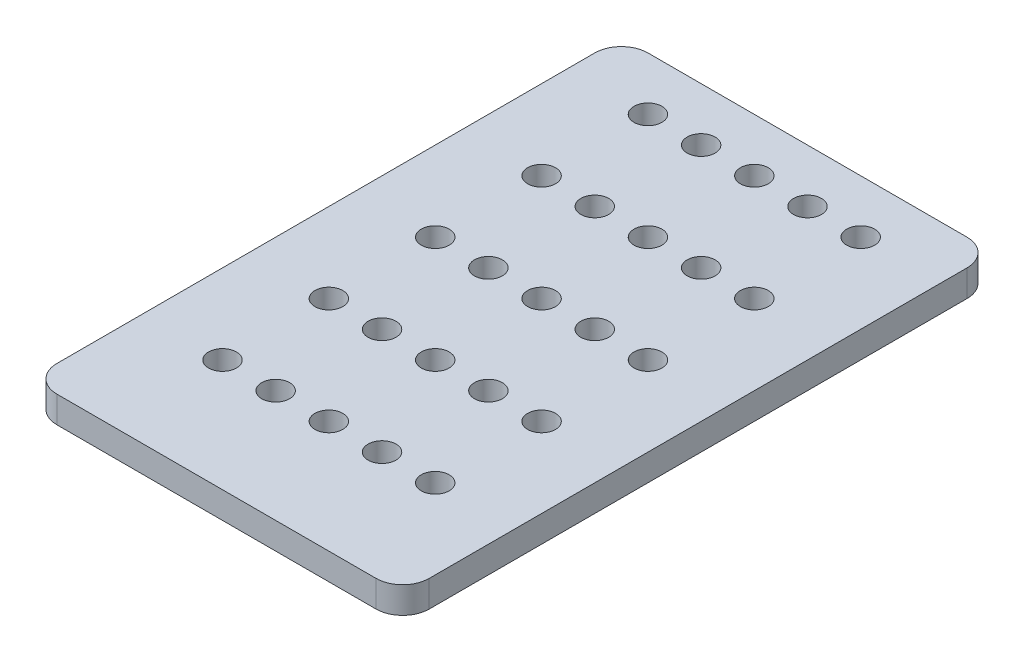
ISO-10303-21;
HEADER;
FILE_DESCRIPTION(('STEP AP214'),'2;1');
FILE_NAME('part.step','',(''),(''),'','','');
FILE_SCHEMA(('AUTOMOTIVE_DESIGN { 1 0 10303 214 1 1 1 1 }'));
ENDSEC;
DATA;
#1=APPLICATION_CONTEXT('core data for automotive mechanical design processes');
#2=APPLICATION_PROTOCOL_DEFINITION('international standard','automotive_design',2000,#1);
#3=PRODUCT_CONTEXT('',#1,'mechanical');
#4=PRODUCT('Part','Part','',(#3));
#5=PRODUCT_RELATED_PRODUCT_CATEGORY('part','',(#4));
#6=PRODUCT_DEFINITION_FORMATION('','',#4);
#7=PRODUCT_DEFINITION_CONTEXT('part definition',#1,'design');
#8=PRODUCT_DEFINITION('design','',#6,#7);
#9=PRODUCT_DEFINITION_SHAPE('','',#8);
#10=(LENGTH_UNIT() NAMED_UNIT(*) SI_UNIT(.MILLI.,.METRE.));
#11=(NAMED_UNIT(*) PLANE_ANGLE_UNIT() SI_UNIT($,.RADIAN.));
#12=(NAMED_UNIT(*) SI_UNIT($,.STERADIAN.) SOLID_ANGLE_UNIT());
#13=UNCERTAINTY_MEASURE_WITH_UNIT(LENGTH_MEASURE(1.E-05),#10,'distance_accuracy_value','');
#14=(GEOMETRIC_REPRESENTATION_CONTEXT(3) GLOBAL_UNCERTAINTY_ASSIGNED_CONTEXT((#13)) GLOBAL_UNIT_ASSIGNED_CONTEXT((#10,
#11,#12)) REPRESENTATION_CONTEXT('',''));
#15=CARTESIAN_POINT('',(0.,0.,0.));
#16=DIRECTION('',(0.,0.,1.));
#17=DIRECTION('',(1.,0.,0.));
#18=AXIS2_PLACEMENT_3D('',#15,#16,#17);
#19=CARTESIAN_POINT('',(0.,4.,0.));
#20=DIRECTION('',(0.,1.,0.));
#21=DIRECTION('',(0.,0.,1.));
#22=AXIS2_PLACEMENT_3D('',#19,#20,#21);
#23=PLANE('',#22);
#24=CARTESIAN_POINT('',(6.6644554730061E-13,4.,64.));
#25=DIRECTION('',(0.,1.,0.));
#26=DIRECTION('',(0.,0.,1.));
#27=AXIS2_PLACEMENT_3D('',#24,#25,#26);
#28=CIRCLE('',#27,2.1);
#29=CARTESIAN_POINT('',(6.6644554730061E-13,4.,66.1));
#30=VERTEX_POINT('',#29);
#31=EDGE_CURVE('E377',#30,#30,#28,.T.);
#32=ORIENTED_EDGE('',*,*,#31,.F.);
#33=EDGE_LOOP('',(#32));
#34=FACE_BOUND('',#33,.T.);
#35=CARTESIAN_POINT('',(16.0000000000007,4.,64.));
#36=DIRECTION('',(0.,1.,0.));
#37=DIRECTION('',(0.,0.,1.));
#38=AXIS2_PLACEMENT_3D('',#35,#36,#37);
#39=CIRCLE('',#38,2.1);
#40=CARTESIAN_POINT('',(16.0000000000007,4.,66.1));
#41=VERTEX_POINT('',#40);
#42=EDGE_CURVE('E361',#41,#41,#39,.T.);
#43=ORIENTED_EDGE('',*,*,#42,.F.);
#44=EDGE_LOOP('',(#43));
#45=FACE_BOUND('',#44,.T.);
#46=CARTESIAN_POINT('',(8.0000000000005,4.,48.));
#47=DIRECTION('',(0.,1.,0.));
#48=DIRECTION('',(0.,0.,1.));
#49=AXIS2_PLACEMENT_3D('',#46,#47,#48);
#50=CIRCLE('',#49,2.1);
#51=CARTESIAN_POINT('',(8.0000000000005,4.,50.1));
#52=VERTEX_POINT('',#51);
#53=EDGE_CURVE('E345',#52,#52,#50,.T.);
#54=ORIENTED_EDGE('',*,*,#53,.F.);
#55=EDGE_LOOP('',(#54));
#56=FACE_BOUND('',#55,.T.);
#57=CARTESIAN_POINT('',(-7.9999999999995,4.,48.));
#58=DIRECTION('',(0.,1.,0.));
#59=DIRECTION('',(0.,0.,1.));
#60=AXIS2_PLACEMENT_3D('',#57,#58,#59);
#61=CIRCLE('',#60,2.1);
#62=CARTESIAN_POINT('',(-7.9999999999995,4.,50.1));
#63=VERTEX_POINT('',#62);
#64=EDGE_CURVE('E329',#63,#63,#61,.T.);
#65=ORIENTED_EDGE('',*,*,#64,.F.);
#66=EDGE_LOOP('',(#65));
#67=FACE_BOUND('',#66,.T.);
#68=CARTESIAN_POINT('',(-15.9999999999995,4.,48.));
#69=DIRECTION('',(0.,1.,0.));
#70=DIRECTION('',(0.,0.,1.));
#71=AXIS2_PLACEMENT_3D('',#68,#69,#70);
#72=CIRCLE('',#71,2.1);
#73=CARTESIAN_POINT('',(-15.9999999999995,4.,50.1));
#74=VERTEX_POINT('',#73);
#75=EDGE_CURVE('E313',#74,#74,#72,.T.);
#76=ORIENTED_EDGE('',*,*,#75,.F.);
#77=EDGE_LOOP('',(#76));
#78=FACE_BOUND('',#77,.T.);
#79=CARTESIAN_POINT('',(3.33222773650305E-13,4.,32.));
#80=DIRECTION('',(0.,1.,0.));
#81=DIRECTION('',(0.,0.,1.));
#82=AXIS2_PLACEMENT_3D('',#79,#80,#81);
#83=CIRCLE('',#82,2.1);
#84=CARTESIAN_POINT('',(3.33222773650305E-13,4.,34.1));
#85=VERTEX_POINT('',#84);
#86=EDGE_CURVE('E297',#85,#85,#83,.T.);
#87=ORIENTED_EDGE('',*,*,#86,.F.);
#88=EDGE_LOOP('',(#87));
#89=FACE_BOUND('',#88,.T.);
#90=CARTESIAN_POINT('',(16.0000000000003,4.,32.));
#91=DIRECTION('',(0.,1.,0.));
#92=DIRECTION('',(0.,0.,1.));
#93=AXIS2_PLACEMENT_3D('',#90,#91,#92);
#94=CIRCLE('',#93,2.1);
#95=CARTESIAN_POINT('',(16.0000000000003,4.,34.1));
#96=VERTEX_POINT('',#95);
#97=EDGE_CURVE('E281',#96,#96,#94,.T.);
#98=ORIENTED_EDGE('',*,*,#97,.F.);
#99=EDGE_LOOP('',(#98));
#100=FACE_BOUND('',#99,.T.);
#101=CARTESIAN_POINT('',(8.00000000000017,4.,16.));
#102=DIRECTION('',(0.,1.,0.));
#103=DIRECTION('',(0.,0.,1.));
#104=AXIS2_PLACEMENT_3D('',#101,#102,#103);
#105=CIRCLE('',#104,2.1);
#106=CARTESIAN_POINT('',(8.00000000000017,4.,18.1));
#107=VERTEX_POINT('',#106);
#108=EDGE_CURVE('E265',#107,#107,#105,.T.);
#109=ORIENTED_EDGE('',*,*,#108,.F.);
#110=EDGE_LOOP('',(#109));
#111=FACE_BOUND('',#110,.T.);
#112=CARTESIAN_POINT('',(-7.99999999999983,4.,16.));
#113=DIRECTION('',(0.,1.,0.));
#114=DIRECTION('',(0.,0.,1.));
#115=AXIS2_PLACEMENT_3D('',#112,#113,#114);
#116=CIRCLE('',#115,2.1);
#117=CARTESIAN_POINT('',(-7.99999999999983,4.,18.1));
#118=VERTEX_POINT('',#117);
#119=EDGE_CURVE('E249',#118,#118,#116,.T.);
#120=ORIENTED_EDGE('',*,*,#119,.F.);
#121=EDGE_LOOP('',(#120));
#122=FACE_BOUND('',#121,.T.);
#123=CARTESIAN_POINT('',(-15.9999999999998,4.,16.));
#124=DIRECTION('',(0.,1.,0.));
#125=DIRECTION('',(0.,0.,1.));
#126=AXIS2_PLACEMENT_3D('',#123,#124,#125);
#127=CIRCLE('',#126,2.1);
#128=CARTESIAN_POINT('',(-15.9999999999998,4.,18.1));
#129=VERTEX_POINT('',#128);
#130=EDGE_CURVE('E233',#129,#129,#127,.T.);
#131=ORIENTED_EDGE('',*,*,#130,.F.);
#132=EDGE_LOOP('',(#131));
#133=FACE_BOUND('',#132,.T.);
#134=CARTESIAN_POINT('',(0.,4.,0.));
#135=DIRECTION('',(0.,1.,0.));
#136=DIRECTION('',(0.,0.,1.));
#137=AXIS2_PLACEMENT_3D('',#134,#135,#136);
#138=CIRCLE('',#137,2.1);
#139=CARTESIAN_POINT('',(0.,4.,2.1));
#140=VERTEX_POINT('',#139);
#141=EDGE_CURVE('E217',#140,#140,#138,.T.);
#142=ORIENTED_EDGE('',*,*,#141,.F.);
#143=EDGE_LOOP('',(#142));
#144=FACE_BOUND('',#143,.T.);
#145=CARTESIAN_POINT('',(16.,4.,0.));
#146=DIRECTION('',(0.,1.,0.));
#147=DIRECTION('',(0.,0.,1.));
#148=AXIS2_PLACEMENT_3D('',#145,#146,#147);
#149=CIRCLE('',#148,2.1);
#150=CARTESIAN_POINT('',(16.,4.,2.09999999999999));
#151=VERTEX_POINT('',#150);
#152=EDGE_CURVE('E201',#151,#151,#149,.T.);
#153=ORIENTED_EDGE('',*,*,#152,.F.);
#154=EDGE_LOOP('',(#153));
#155=FACE_BOUND('',#154,.T.);
#156=DIRECTION('',(0.,0.,1.));
#157=VECTOR('',#156,1.);
#158=CARTESIAN_POINT('',(-28.,4.,-7.99999999999999));
#159=LINE('',#158,#157);
#160=CARTESIAN_POINT('',(-28.,4.,-3.99999999999999));
#161=VERTEX_POINT('',#160);
#162=CARTESIAN_POINT('',(-27.9999999999998,4.,76.9));
#163=VERTEX_POINT('',#162);
#164=EDGE_CURVE('E152',#161,#163,#159,.T.);
#165=ORIENTED_EDGE('',*,*,#164,.T.);
#166=CARTESIAN_POINT('',(-23.9999999999998,4.,76.9));
#167=DIRECTION('',(0.,1.,0.));
#168=DIRECTION('',(0.,0.,1.));
#169=AXIS2_PLACEMENT_3D('',#166,#167,#168);
#170=CIRCLE('',#169,4.);
#171=CARTESIAN_POINT('',(-23.9999999999998,4.,80.9));
#172=VERTEX_POINT('',#171);
#173=EDGE_CURVE('E176',#163,#172,#170,.T.);
#174=ORIENTED_EDGE('',*,*,#173,.T.);
#175=DIRECTION('',(1.,0.,0.));
#176=VECTOR('',#175,1.);
#177=CARTESIAN_POINT('',(-27.9999999999998,4.,80.9));
#178=LINE('',#177,#176);
#179=CARTESIAN_POINT('',(23.9999999999998,4.,80.9));
#180=VERTEX_POINT('',#179);
#181=EDGE_CURVE('E129',#172,#180,#178,.T.);
#182=ORIENTED_EDGE('',*,*,#181,.T.);
#183=CARTESIAN_POINT('',(23.9999999999998,4.,76.9));
#184=DIRECTION('',(0.,1.,0.));
#185=DIRECTION('',(0.,0.,1.));
#186=AXIS2_PLACEMENT_3D('',#183,#184,#185);
#187=CIRCLE('',#186,4.);
#188=CARTESIAN_POINT('',(27.9999999999998,4.,76.9));
#189=VERTEX_POINT('',#188);
#190=EDGE_CURVE('E173',#180,#189,#187,.T.);
#191=ORIENTED_EDGE('',*,*,#190,.T.);
#192=DIRECTION('',(0.,0.,-1.));
#193=VECTOR('',#192,1.);
#194=CARTESIAN_POINT('',(28.,4.,-7.99999999999999));
#195=LINE('',#194,#193);
#196=CARTESIAN_POINT('',(28.,4.,-3.99999999999999));
#197=VERTEX_POINT('',#196);
#198=EDGE_CURVE('E188',#189,#197,#195,.T.);
#199=ORIENTED_EDGE('',*,*,#198,.T.);
#200=CARTESIAN_POINT('',(24.,4.,-3.99999999999999));
#201=DIRECTION('',(0.,1.,0.));
#202=DIRECTION('',(0.,0.,1.));
#203=AXIS2_PLACEMENT_3D('',#200,#201,#202);
#204=CIRCLE('',#203,4.);
#205=CARTESIAN_POINT('',(24.,4.,-7.99999999999999));
#206=VERTEX_POINT('',#205);
#207=EDGE_CURVE('E63',#197,#206,#204,.T.);
#208=ORIENTED_EDGE('',*,*,#207,.T.);
#209=DIRECTION('',(-1.,0.,0.));
#210=VECTOR('',#209,1.);
#211=CARTESIAN_POINT('',(-28.,4.,-7.99999999999999));
#212=LINE('',#211,#210);
#213=CARTESIAN_POINT('',(-24.,4.,-7.99999999999999));
#214=VERTEX_POINT('',#213);
#215=EDGE_CURVE('E154',#206,#214,#212,.T.);
#216=ORIENTED_EDGE('',*,*,#215,.T.);
#217=CARTESIAN_POINT('',(-24.,4.,-3.99999999999999));
#218=DIRECTION('',(0.,1.,0.));
#219=DIRECTION('',(0.,0.,1.));
#220=AXIS2_PLACEMENT_3D('',#217,#218,#219);
#221=CIRCLE('',#220,4.);
#222=EDGE_CURVE('E168',#214,#161,#221,.T.);
#223=ORIENTED_EDGE('',*,*,#222,.T.);
#224=EDGE_LOOP('',(#165,#174,#182,#191,#199,#208,#216,#223));
#225=FACE_BOUND('',#224,.T.);
#226=CARTESIAN_POINT('',(-16.,4.,0.));
#227=DIRECTION('',(0.,1.,0.));
#228=DIRECTION('',(0.,0.,1.));
#229=AXIS2_PLACEMENT_3D('',#226,#227,#228);
#230=CIRCLE('',#229,2.1);
#231=CARTESIAN_POINT('',(-16.,4.,2.1));
#232=VERTEX_POINT('',#231);
#233=EDGE_CURVE('E146',#232,#232,#230,.T.);
#234=ORIENTED_EDGE('',*,*,#233,.F.);
#235=EDGE_LOOP('',(#234));
#236=FACE_BOUND('',#235,.T.);
#237=CARTESIAN_POINT('',(-8.,4.,0.));
#238=DIRECTION('',(0.,1.,0.));
#239=DIRECTION('',(0.,0.,1.));
#240=AXIS2_PLACEMENT_3D('',#237,#238,#239);
#241=CIRCLE('',#240,2.1);
#242=CARTESIAN_POINT('',(-8.,4.,2.1));
#243=VERTEX_POINT('',#242);
#244=EDGE_CURVE('E209',#243,#243,#241,.T.);
#245=ORIENTED_EDGE('',*,*,#244,.F.);
#246=EDGE_LOOP('',(#245));
#247=FACE_BOUND('',#246,.T.);
#248=CARTESIAN_POINT('',(8.,4.,0.));
#249=DIRECTION('',(0.,1.,0.));
#250=DIRECTION('',(0.,0.,1.));
#251=AXIS2_PLACEMENT_3D('',#248,#249,#250);
#252=CIRCLE('',#251,2.1);
#253=CARTESIAN_POINT('',(8.,4.,2.1));
#254=VERTEX_POINT('',#253);
#255=EDGE_CURVE('E225',#254,#254,#252,.T.);
#256=ORIENTED_EDGE('',*,*,#255,.F.);
#257=EDGE_LOOP('',(#256));
#258=FACE_BOUND('',#257,.T.);
#259=CARTESIAN_POINT('',(16.0000000000002,4.,16.));
#260=DIRECTION('',(0.,1.,0.));
#261=DIRECTION('',(0.,0.,1.));
#262=AXIS2_PLACEMENT_3D('',#259,#260,#261);
#263=CIRCLE('',#262,2.1);
#264=CARTESIAN_POINT('',(16.0000000000002,4.,18.1));
#265=VERTEX_POINT('',#264);
#266=EDGE_CURVE('E241',#265,#265,#263,.T.);
#267=ORIENTED_EDGE('',*,*,#266,.F.);
#268=EDGE_LOOP('',(#267));
#269=FACE_BOUND('',#268,.T.);
#270=CARTESIAN_POINT('',(1.66611386825153E-13,4.,16.));
#271=DIRECTION('',(0.,1.,0.));
#272=DIRECTION('',(0.,0.,1.));
#273=AXIS2_PLACEMENT_3D('',#270,#271,#272);
#274=CIRCLE('',#273,2.1);
#275=CARTESIAN_POINT('',(1.66611386825153E-13,4.,18.1));
#276=VERTEX_POINT('',#275);
#277=EDGE_CURVE('E257',#276,#276,#274,.T.);
#278=ORIENTED_EDGE('',*,*,#277,.F.);
#279=EDGE_LOOP('',(#278));
#280=FACE_BOUND('',#279,.T.);
#281=CARTESIAN_POINT('',(-15.9999999999997,4.,32.));
#282=DIRECTION('',(0.,1.,0.));
#283=DIRECTION('',(0.,0.,1.));
#284=AXIS2_PLACEMENT_3D('',#281,#282,#283);
#285=CIRCLE('',#284,2.1);
#286=CARTESIAN_POINT('',(-15.9999999999997,4.,34.1));
#287=VERTEX_POINT('',#286);
#288=EDGE_CURVE('E273',#287,#287,#285,.T.);
#289=ORIENTED_EDGE('',*,*,#288,.F.);
#290=EDGE_LOOP('',(#289));
#291=FACE_BOUND('',#290,.T.);
#292=CARTESIAN_POINT('',(-7.99999999999967,4.,32.));
#293=DIRECTION('',(0.,1.,0.));
#294=DIRECTION('',(0.,0.,1.));
#295=AXIS2_PLACEMENT_3D('',#292,#293,#294);
#296=CIRCLE('',#295,2.1);
#297=CARTESIAN_POINT('',(-7.99999999999967,4.,34.1));
#298=VERTEX_POINT('',#297);
#299=EDGE_CURVE('E289',#298,#298,#296,.T.);
#300=ORIENTED_EDGE('',*,*,#299,.F.);
#301=EDGE_LOOP('',(#300));
#302=FACE_BOUND('',#301,.T.);
#303=CARTESIAN_POINT('',(8.00000000000033,4.,32.));
#304=DIRECTION('',(0.,1.,0.));
#305=DIRECTION('',(0.,0.,1.));
#306=AXIS2_PLACEMENT_3D('',#303,#304,#305);
#307=CIRCLE('',#306,2.1);
#308=CARTESIAN_POINT('',(8.00000000000033,4.,34.1));
#309=VERTEX_POINT('',#308);
#310=EDGE_CURVE('E305',#309,#309,#307,.T.);
#311=ORIENTED_EDGE('',*,*,#310,.F.);
#312=EDGE_LOOP('',(#311));
#313=FACE_BOUND('',#312,.T.);
#314=CARTESIAN_POINT('',(16.0000000000005,4.,48.));
#315=DIRECTION('',(0.,1.,0.));
#316=DIRECTION('',(0.,0.,1.));
#317=AXIS2_PLACEMENT_3D('',#314,#315,#316);
#318=CIRCLE('',#317,2.1);
#319=CARTESIAN_POINT('',(16.0000000000005,4.,50.1));
#320=VERTEX_POINT('',#319);
#321=EDGE_CURVE('E321',#320,#320,#318,.T.);
#322=ORIENTED_EDGE('',*,*,#321,.F.);
#323=EDGE_LOOP('',(#322));
#324=FACE_BOUND('',#323,.T.);
#325=CARTESIAN_POINT('',(4.99834160475458E-13,4.,48.));
#326=DIRECTION('',(0.,1.,0.));
#327=DIRECTION('',(0.,0.,1.));
#328=AXIS2_PLACEMENT_3D('',#325,#326,#327);
#329=CIRCLE('',#328,2.1);
#330=CARTESIAN_POINT('',(4.99834160475458E-13,4.,50.1));
#331=VERTEX_POINT('',#330);
#332=EDGE_CURVE('E337',#331,#331,#329,.T.);
#333=ORIENTED_EDGE('',*,*,#332,.F.);
#334=EDGE_LOOP('',(#333));
#335=FACE_BOUND('',#334,.T.);
#336=CARTESIAN_POINT('',(-15.9999999999993,4.,64.));
#337=DIRECTION('',(0.,1.,0.));
#338=DIRECTION('',(0.,0.,1.));
#339=AXIS2_PLACEMENT_3D('',#336,#337,#338);
#340=CIRCLE('',#339,2.1);
#341=CARTESIAN_POINT('',(-15.9999999999993,4.,66.1));
#342=VERTEX_POINT('',#341);
#343=EDGE_CURVE('E353',#342,#342,#340,.T.);
#344=ORIENTED_EDGE('',*,*,#343,.F.);
#345=EDGE_LOOP('',(#344));
#346=FACE_BOUND('',#345,.T.);
#347=CARTESIAN_POINT('',(-7.99999999999933,4.,64.));
#348=DIRECTION('',(0.,1.,0.));
#349=DIRECTION('',(0.,0.,1.));
#350=AXIS2_PLACEMENT_3D('',#347,#348,#349);
#351=CIRCLE('',#350,2.1);
#352=CARTESIAN_POINT('',(-7.99999999999933,4.,66.1));
#353=VERTEX_POINT('',#352);
#354=EDGE_CURVE('E369',#353,#353,#351,.T.);
#355=ORIENTED_EDGE('',*,*,#354,.F.);
#356=EDGE_LOOP('',(#355));
#357=FACE_BOUND('',#356,.T.);
#358=CARTESIAN_POINT('',(8.00000000000067,4.,64.));
#359=DIRECTION('',(0.,1.,0.));
#360=DIRECTION('',(0.,0.,1.));
#361=AXIS2_PLACEMENT_3D('',#358,#359,#360);
#362=CIRCLE('',#361,2.1);
#363=CARTESIAN_POINT('',(8.00000000000067,4.,66.1));
#364=VERTEX_POINT('',#363);
#365=EDGE_CURVE('E385',#364,#364,#362,.T.);
#366=ORIENTED_EDGE('',*,*,#365,.F.);
#367=EDGE_LOOP('',(#366));
#368=FACE_BOUND('',#367,.T.);
#369=ADVANCED_FACE('F41',(#34,#45,#56,#67,#78,#89,#100,#111,#122,#133,#144,#155,#225,#236,#247,
#258,#269,#280,#291,#302,#313,#324,#335,#346,#357,#368),#23,.T.);
#370=CARTESIAN_POINT('',(0.,0.,0.));
#371=DIRECTION('',(0.,1.,0.));
#372=DIRECTION('',(0.,0.,1.));
#373=AXIS2_PLACEMENT_3D('',#370,#371,#372);
#374=PLANE('',#373);
#375=DIRECTION('',(1.,0.,0.));
#376=VECTOR('',#375,1.);
#377=CARTESIAN_POINT('',(-27.9999999999998,0.,80.9));
#378=LINE('',#377,#376);
#379=CARTESIAN_POINT('',(-23.9999999999998,0.,80.9));
#380=VERTEX_POINT('',#379);
#381=CARTESIAN_POINT('',(23.9999999999998,0.,80.9));
#382=VERTEX_POINT('',#381);
#383=EDGE_CURVE('E126',#380,#382,#378,.T.);
#384=ORIENTED_EDGE('',*,*,#383,.F.);
#385=CARTESIAN_POINT('',(-23.9999999999998,0.,76.9));
#386=DIRECTION('',(0.,1.,0.));
#387=DIRECTION('',(0.,0.,1.));
#388=AXIS2_PLACEMENT_3D('',#385,#386,#387);
#389=CIRCLE('',#388,4.);
#390=CARTESIAN_POINT('',(-27.9999999999998,0.,76.9));
#391=VERTEX_POINT('',#390);
#392=EDGE_CURVE('E108',#380,#391,#389,.F.);
#393=ORIENTED_EDGE('',*,*,#392,.T.);
#394=DIRECTION('',(0.,0.,1.));
#395=VECTOR('',#394,1.);
#396=CARTESIAN_POINT('',(-28.,0.,-7.99999999999999));
#397=LINE('',#396,#395);
#398=CARTESIAN_POINT('',(-28.,0.,-3.99999999999999));
#399=VERTEX_POINT('',#398);
#400=EDGE_CURVE('E139',#399,#391,#397,.T.);
#401=ORIENTED_EDGE('',*,*,#400,.F.);
#402=CARTESIAN_POINT('',(-24.,0.,-3.99999999999999));
#403=DIRECTION('',(0.,1.,0.));
#404=DIRECTION('',(0.,0.,1.));
#405=AXIS2_PLACEMENT_3D('',#402,#403,#404);
#406=CIRCLE('',#405,4.);
#407=CARTESIAN_POINT('',(-24.,0.,-7.99999999999999));
#408=VERTEX_POINT('',#407);
#409=EDGE_CURVE('E131',#399,#408,#406,.F.);
#410=ORIENTED_EDGE('',*,*,#409,.T.);
#411=DIRECTION('',(-1.,0.,0.));
#412=VECTOR('',#411,1.);
#413=CARTESIAN_POINT('',(-28.,0.,-7.99999999999999));
#414=LINE('',#413,#412);
#415=CARTESIAN_POINT('',(24.,0.,-7.99999999999999));
#416=VERTEX_POINT('',#415);
#417=EDGE_CURVE('E144',#416,#408,#414,.T.);
#418=ORIENTED_EDGE('',*,*,#417,.F.);
#419=CARTESIAN_POINT('',(24.,0.,-3.99999999999999));
#420=DIRECTION('',(0.,1.,0.));
#421=DIRECTION('',(0.,0.,1.));
#422=AXIS2_PLACEMENT_3D('',#419,#420,#421);
#423=CIRCLE('',#422,4.);
#424=CARTESIAN_POINT('',(28.,0.,-3.99999999999999));
#425=VERTEX_POINT('',#424);
#426=EDGE_CURVE('E158',#416,#425,#423,.F.);
#427=ORIENTED_EDGE('',*,*,#426,.T.);
#428=DIRECTION('',(0.,0.,-1.));
#429=VECTOR('',#428,1.);
#430=CARTESIAN_POINT('',(28.,0.,-7.99999999999999));
#431=LINE('',#430,#429);
#432=CARTESIAN_POINT('',(27.9999999999998,0.,76.9));
#433=VERTEX_POINT('',#432);
#434=EDGE_CURVE('E138',#433,#425,#431,.T.);
#435=ORIENTED_EDGE('',*,*,#434,.F.);
#436=CARTESIAN_POINT('',(23.9999999999998,0.,76.9));
#437=DIRECTION('',(0.,1.,0.));
#438=DIRECTION('',(0.,0.,1.));
#439=AXIS2_PLACEMENT_3D('',#436,#437,#438);
#440=CIRCLE('',#439,4.);
#441=EDGE_CURVE('E120',#433,#382,#440,.F.);
#442=ORIENTED_EDGE('',*,*,#441,.T.);
#443=EDGE_LOOP('',(#384,#393,#401,#410,#418,#427,#435,#442));
#444=FACE_BOUND('',#443,.T.);
#445=CARTESIAN_POINT('',(-16.,0.,0.));
#446=DIRECTION('',(0.,1.,0.));
#447=DIRECTION('',(0.,0.,1.));
#448=AXIS2_PLACEMENT_3D('',#445,#446,#447);
#449=CIRCLE('',#448,2.1);
#450=CARTESIAN_POINT('',(-16.,0.,2.1));
#451=VERTEX_POINT('',#450);
#452=EDGE_CURVE('E197',#451,#451,#449,.T.);
#453=ORIENTED_EDGE('',*,*,#452,.T.);
#454=EDGE_LOOP('',(#453));
#455=FACE_BOUND('',#454,.T.);
#456=CARTESIAN_POINT('',(16.,0.,0.));
#457=DIRECTION('',(0.,1.,0.));
#458=DIRECTION('',(0.,0.,1.));
#459=AXIS2_PLACEMENT_3D('',#456,#457,#458);
#460=CIRCLE('',#459,2.1);
#461=CARTESIAN_POINT('',(16.,0.,2.09999999999999));
#462=VERTEX_POINT('',#461);
#463=EDGE_CURVE('E205',#462,#462,#460,.T.);
#464=ORIENTED_EDGE('',*,*,#463,.T.);
#465=EDGE_LOOP('',(#464));
#466=FACE_BOUND('',#465,.T.);
#467=CARTESIAN_POINT('',(-8.,0.,0.));
#468=DIRECTION('',(0.,1.,0.));
#469=DIRECTION('',(0.,0.,1.));
#470=AXIS2_PLACEMENT_3D('',#467,#468,#469);
#471=CIRCLE('',#470,2.1);
#472=CARTESIAN_POINT('',(-8.,0.,2.1));
#473=VERTEX_POINT('',#472);
#474=EDGE_CURVE('E213',#473,#473,#471,.T.);
#475=ORIENTED_EDGE('',*,*,#474,.T.);
#476=EDGE_LOOP('',(#475));
#477=FACE_BOUND('',#476,.T.);
#478=CARTESIAN_POINT('',(0.,0.,0.));
#479=DIRECTION('',(0.,1.,0.));
#480=DIRECTION('',(0.,0.,1.));
#481=AXIS2_PLACEMENT_3D('',#478,#479,#480);
#482=CIRCLE('',#481,2.1);
#483=CARTESIAN_POINT('',(0.,0.,2.1));
#484=VERTEX_POINT('',#483);
#485=EDGE_CURVE('E221',#484,#484,#482,.T.);
#486=ORIENTED_EDGE('',*,*,#485,.T.);
#487=EDGE_LOOP('',(#486));
#488=FACE_BOUND('',#487,.T.);
#489=CARTESIAN_POINT('',(8.,0.,0.));
#490=DIRECTION('',(0.,1.,0.));
#491=DIRECTION('',(0.,0.,1.));
#492=AXIS2_PLACEMENT_3D('',#489,#490,#491);
#493=CIRCLE('',#492,2.1);
#494=CARTESIAN_POINT('',(8.,0.,2.1));
#495=VERTEX_POINT('',#494);
#496=EDGE_CURVE('E229',#495,#495,#493,.T.);
#497=ORIENTED_EDGE('',*,*,#496,.T.);
#498=EDGE_LOOP('',(#497));
#499=FACE_BOUND('',#498,.T.);
#500=CARTESIAN_POINT('',(-15.9999999999998,0.,16.));
#501=DIRECTION('',(0.,1.,0.));
#502=DIRECTION('',(0.,0.,1.));
#503=AXIS2_PLACEMENT_3D('',#500,#501,#502);
#504=CIRCLE('',#503,2.1);
#505=CARTESIAN_POINT('',(-15.9999999999998,0.,18.1));
#506=VERTEX_POINT('',#505);
#507=EDGE_CURVE('E237',#506,#506,#504,.T.);
#508=ORIENTED_EDGE('',*,*,#507,.T.);
#509=EDGE_LOOP('',(#508));
#510=FACE_BOUND('',#509,.T.);
#511=CARTESIAN_POINT('',(16.0000000000002,0.,16.));
#512=DIRECTION('',(0.,1.,0.));
#513=DIRECTION('',(0.,0.,1.));
#514=AXIS2_PLACEMENT_3D('',#511,#512,#513);
#515=CIRCLE('',#514,2.1);
#516=CARTESIAN_POINT('',(16.0000000000002,0.,18.1));
#517=VERTEX_POINT('',#516);
#518=EDGE_CURVE('E245',#517,#517,#515,.T.);
#519=ORIENTED_EDGE('',*,*,#518,.T.);
#520=EDGE_LOOP('',(#519));
#521=FACE_BOUND('',#520,.T.);
#522=CARTESIAN_POINT('',(-7.99999999999983,0.,16.));
#523=DIRECTION('',(0.,1.,0.));
#524=DIRECTION('',(0.,0.,1.));
#525=AXIS2_PLACEMENT_3D('',#522,#523,#524);
#526=CIRCLE('',#525,2.1);
#527=CARTESIAN_POINT('',(-7.99999999999983,0.,18.1));
#528=VERTEX_POINT('',#527);
#529=EDGE_CURVE('E253',#528,#528,#526,.T.);
#530=ORIENTED_EDGE('',*,*,#529,.T.);
#531=EDGE_LOOP('',(#530));
#532=FACE_BOUND('',#531,.T.);
#533=CARTESIAN_POINT('',(1.66611386825153E-13,0.,16.));
#534=DIRECTION('',(0.,1.,0.));
#535=DIRECTION('',(0.,0.,1.));
#536=AXIS2_PLACEMENT_3D('',#533,#534,#535);
#537=CIRCLE('',#536,2.1);
#538=CARTESIAN_POINT('',(1.66611386825153E-13,0.,18.1));
#539=VERTEX_POINT('',#538);
#540=EDGE_CURVE('E261',#539,#539,#537,.T.);
#541=ORIENTED_EDGE('',*,*,#540,.T.);
#542=EDGE_LOOP('',(#541));
#543=FACE_BOUND('',#542,.T.);
#544=CARTESIAN_POINT('',(8.00000000000017,0.,16.));
#545=DIRECTION('',(0.,1.,0.));
#546=DIRECTION('',(0.,0.,1.));
#547=AXIS2_PLACEMENT_3D('',#544,#545,#546);
#548=CIRCLE('',#547,2.1);
#549=CARTESIAN_POINT('',(8.00000000000017,0.,18.1));
#550=VERTEX_POINT('',#549);
#551=EDGE_CURVE('E269',#550,#550,#548,.T.);
#552=ORIENTED_EDGE('',*,*,#551,.T.);
#553=EDGE_LOOP('',(#552));
#554=FACE_BOUND('',#553,.T.);
#555=CARTESIAN_POINT('',(-15.9999999999997,0.,32.));
#556=DIRECTION('',(0.,1.,0.));
#557=DIRECTION('',(0.,0.,1.));
#558=AXIS2_PLACEMENT_3D('',#555,#556,#557);
#559=CIRCLE('',#558,2.1);
#560=CARTESIAN_POINT('',(-15.9999999999997,0.,34.1));
#561=VERTEX_POINT('',#560);
#562=EDGE_CURVE('E277',#561,#561,#559,.T.);
#563=ORIENTED_EDGE('',*,*,#562,.T.);
#564=EDGE_LOOP('',(#563));
#565=FACE_BOUND('',#564,.T.);
#566=CARTESIAN_POINT('',(16.0000000000003,0.,32.));
#567=DIRECTION('',(0.,1.,0.));
#568=DIRECTION('',(0.,0.,1.));
#569=AXIS2_PLACEMENT_3D('',#566,#567,#568);
#570=CIRCLE('',#569,2.1);
#571=CARTESIAN_POINT('',(16.0000000000003,0.,34.1));
#572=VERTEX_POINT('',#571);
#573=EDGE_CURVE('E285',#572,#572,#570,.T.);
#574=ORIENTED_EDGE('',*,*,#573,.T.);
#575=EDGE_LOOP('',(#574));
#576=FACE_BOUND('',#575,.T.);
#577=CARTESIAN_POINT('',(-7.99999999999967,0.,32.));
#578=DIRECTION('',(0.,1.,0.));
#579=DIRECTION('',(0.,0.,1.));
#580=AXIS2_PLACEMENT_3D('',#577,#578,#579);
#581=CIRCLE('',#580,2.1);
#582=CARTESIAN_POINT('',(-7.99999999999967,0.,34.1));
#583=VERTEX_POINT('',#582);
#584=EDGE_CURVE('E293',#583,#583,#581,.T.);
#585=ORIENTED_EDGE('',*,*,#584,.T.);
#586=EDGE_LOOP('',(#585));
#587=FACE_BOUND('',#586,.T.);
#588=CARTESIAN_POINT('',(3.33222773650305E-13,0.,32.));
#589=DIRECTION('',(0.,1.,0.));
#590=DIRECTION('',(0.,0.,1.));
#591=AXIS2_PLACEMENT_3D('',#588,#589,#590);
#592=CIRCLE('',#591,2.1);
#593=CARTESIAN_POINT('',(3.33222773650305E-13,0.,34.1));
#594=VERTEX_POINT('',#593);
#595=EDGE_CURVE('E301',#594,#594,#592,.T.);
#596=ORIENTED_EDGE('',*,*,#595,.T.);
#597=EDGE_LOOP('',(#596));
#598=FACE_BOUND('',#597,.T.);
#599=CARTESIAN_POINT('',(8.00000000000033,0.,32.));
#600=DIRECTION('',(0.,1.,0.));
#601=DIRECTION('',(0.,0.,1.));
#602=AXIS2_PLACEMENT_3D('',#599,#600,#601);
#603=CIRCLE('',#602,2.1);
#604=CARTESIAN_POINT('',(8.00000000000033,0.,34.1));
#605=VERTEX_POINT('',#604);
#606=EDGE_CURVE('E309',#605,#605,#603,.T.);
#607=ORIENTED_EDGE('',*,*,#606,.T.);
#608=EDGE_LOOP('',(#607));
#609=FACE_BOUND('',#608,.T.);
#610=CARTESIAN_POINT('',(-15.9999999999995,0.,48.));
#611=DIRECTION('',(0.,1.,0.));
#612=DIRECTION('',(0.,0.,1.));
#613=AXIS2_PLACEMENT_3D('',#610,#611,#612);
#614=CIRCLE('',#613,2.1);
#615=CARTESIAN_POINT('',(-15.9999999999995,0.,50.1));
#616=VERTEX_POINT('',#615);
#617=EDGE_CURVE('E317',#616,#616,#614,.T.);
#618=ORIENTED_EDGE('',*,*,#617,.T.);
#619=EDGE_LOOP('',(#618));
#620=FACE_BOUND('',#619,.T.);
#621=CARTESIAN_POINT('',(16.0000000000005,0.,48.));
#622=DIRECTION('',(0.,1.,0.));
#623=DIRECTION('',(0.,0.,1.));
#624=AXIS2_PLACEMENT_3D('',#621,#622,#623);
#625=CIRCLE('',#624,2.1);
#626=CARTESIAN_POINT('',(16.0000000000005,0.,50.1));
#627=VERTEX_POINT('',#626);
#628=EDGE_CURVE('E325',#627,#627,#625,.T.);
#629=ORIENTED_EDGE('',*,*,#628,.T.);
#630=EDGE_LOOP('',(#629));
#631=FACE_BOUND('',#630,.T.);
#632=CARTESIAN_POINT('',(-7.9999999999995,0.,48.));
#633=DIRECTION('',(0.,1.,0.));
#634=DIRECTION('',(0.,0.,1.));
#635=AXIS2_PLACEMENT_3D('',#632,#633,#634);
#636=CIRCLE('',#635,2.1);
#637=CARTESIAN_POINT('',(-7.9999999999995,0.,50.1));
#638=VERTEX_POINT('',#637);
#639=EDGE_CURVE('E333',#638,#638,#636,.T.);
#640=ORIENTED_EDGE('',*,*,#639,.T.);
#641=EDGE_LOOP('',(#640));
#642=FACE_BOUND('',#641,.T.);
#643=CARTESIAN_POINT('',(4.99834160475458E-13,0.,48.));
#644=DIRECTION('',(0.,1.,0.));
#645=DIRECTION('',(0.,0.,1.));
#646=AXIS2_PLACEMENT_3D('',#643,#644,#645);
#647=CIRCLE('',#646,2.1);
#648=CARTESIAN_POINT('',(4.99834160475458E-13,0.,50.1));
#649=VERTEX_POINT('',#648);
#650=EDGE_CURVE('E341',#649,#649,#647,.T.);
#651=ORIENTED_EDGE('',*,*,#650,.T.);
#652=EDGE_LOOP('',(#651));
#653=FACE_BOUND('',#652,.T.);
#654=CARTESIAN_POINT('',(8.0000000000005,0.,48.));
#655=DIRECTION('',(0.,1.,0.));
#656=DIRECTION('',(0.,0.,1.));
#657=AXIS2_PLACEMENT_3D('',#654,#655,#656);
#658=CIRCLE('',#657,2.1);
#659=CARTESIAN_POINT('',(8.0000000000005,0.,50.1));
#660=VERTEX_POINT('',#659);
#661=EDGE_CURVE('E349',#660,#660,#658,.T.);
#662=ORIENTED_EDGE('',*,*,#661,.T.);
#663=EDGE_LOOP('',(#662));
#664=FACE_BOUND('',#663,.T.);
#665=CARTESIAN_POINT('',(-15.9999999999993,0.,64.));
#666=DIRECTION('',(0.,1.,0.));
#667=DIRECTION('',(0.,0.,1.));
#668=AXIS2_PLACEMENT_3D('',#665,#666,#667);
#669=CIRCLE('',#668,2.1);
#670=CARTESIAN_POINT('',(-15.9999999999993,0.,66.1));
#671=VERTEX_POINT('',#670);
#672=EDGE_CURVE('E357',#671,#671,#669,.T.);
#673=ORIENTED_EDGE('',*,*,#672,.T.);
#674=EDGE_LOOP('',(#673));
#675=FACE_BOUND('',#674,.T.);
#676=CARTESIAN_POINT('',(16.0000000000007,0.,64.));
#677=DIRECTION('',(0.,1.,0.));
#678=DIRECTION('',(0.,0.,1.));
#679=AXIS2_PLACEMENT_3D('',#676,#677,#678);
#680=CIRCLE('',#679,2.1);
#681=CARTESIAN_POINT('',(16.0000000000007,0.,66.1));
#682=VERTEX_POINT('',#681);
#683=EDGE_CURVE('E365',#682,#682,#680,.T.);
#684=ORIENTED_EDGE('',*,*,#683,.T.);
#685=EDGE_LOOP('',(#684));
#686=FACE_BOUND('',#685,.T.);
#687=CARTESIAN_POINT('',(-7.99999999999933,0.,64.));
#688=DIRECTION('',(0.,1.,0.));
#689=DIRECTION('',(0.,0.,1.));
#690=AXIS2_PLACEMENT_3D('',#687,#688,#689);
#691=CIRCLE('',#690,2.1);
#692=CARTESIAN_POINT('',(-7.99999999999933,0.,66.1));
#693=VERTEX_POINT('',#692);
#694=EDGE_CURVE('E373',#693,#693,#691,.T.);
#695=ORIENTED_EDGE('',*,*,#694,.T.);
#696=EDGE_LOOP('',(#695));
#697=FACE_BOUND('',#696,.T.);
#698=CARTESIAN_POINT('',(6.6644554730061E-13,0.,64.));
#699=DIRECTION('',(0.,1.,0.));
#700=DIRECTION('',(0.,0.,1.));
#701=AXIS2_PLACEMENT_3D('',#698,#699,#700);
#702=CIRCLE('',#701,2.1);
#703=CARTESIAN_POINT('',(6.6644554730061E-13,0.,66.1));
#704=VERTEX_POINT('',#703);
#705=EDGE_CURVE('E381',#704,#704,#702,.T.);
#706=ORIENTED_EDGE('',*,*,#705,.T.);
#707=EDGE_LOOP('',(#706));
#708=FACE_BOUND('',#707,.T.);
#709=CARTESIAN_POINT('',(8.00000000000067,0.,64.));
#710=DIRECTION('',(0.,1.,0.));
#711=DIRECTION('',(0.,0.,1.));
#712=AXIS2_PLACEMENT_3D('',#709,#710,#711);
#713=CIRCLE('',#712,2.1);
#714=CARTESIAN_POINT('',(8.00000000000067,0.,66.1));
#715=VERTEX_POINT('',#714);
#716=EDGE_CURVE('E389',#715,#715,#713,.T.);
#717=ORIENTED_EDGE('',*,*,#716,.T.);
#718=EDGE_LOOP('',(#717));
#719=FACE_BOUND('',#718,.T.);
#720=ADVANCED_FACE('F134',(#444,#455,#466,#477,#488,#499,#510,#521,#532,#543,#554,#565,#576,
#587,#598,#609,#620,#631,#642,#653,#664,#675,#686,#697,#708,#719),#374,.F.);
#721=CARTESIAN_POINT('',(-28.,4.,-7.99999999999999));
#722=DIRECTION('',(1.,0.,0.));
#723=DIRECTION('',(0.,0.,-1.));
#724=AXIS2_PLACEMENT_3D('',#721,#722,#723);
#725=PLANE('',#724);
#726=ORIENTED_EDGE('',*,*,#400,.T.);
#727=DIRECTION('',(0.,-1.,0.));
#728=VECTOR('',#727,1.);
#729=CARTESIAN_POINT('',(-27.9999999999998,4.,76.9));
#730=LINE('',#729,#728);
#731=EDGE_CURVE('E113',#391,#163,#730,.F.);
#732=ORIENTED_EDGE('',*,*,#731,.T.);
#733=ORIENTED_EDGE('',*,*,#164,.F.);
#734=DIRECTION('',(0.,-1.,0.));
#735=VECTOR('',#734,1.);
#736=CARTESIAN_POINT('',(-28.,4.,-3.99999999999999));
#737=LINE('',#736,#735);
#738=EDGE_CURVE('E119',#161,#399,#737,.T.);
#739=ORIENTED_EDGE('',*,*,#738,.T.);
#740=EDGE_LOOP('',(#726,#732,#733,#739));
#741=FACE_BOUND('',#740,.T.);
#742=ADVANCED_FACE('F406',(#741),#725,.F.);
#743=CARTESIAN_POINT('',(-27.9999999999998,4.,80.9));
#744=DIRECTION('',(0.,0.,-1.));
#745=DIRECTION('',(-1.,0.,0.));
#746=AXIS2_PLACEMENT_3D('',#743,#744,#745);
#747=PLANE('',#746);
#748=ORIENTED_EDGE('',*,*,#181,.F.);
#749=DIRECTION('',(0.,-1.,0.));
#750=VECTOR('',#749,1.);
#751=CARTESIAN_POINT('',(-23.9999999999998,4.,80.9));
#752=LINE('',#751,#750);
#753=EDGE_CURVE('E112',#172,#380,#752,.T.);
#754=ORIENTED_EDGE('',*,*,#753,.T.);
#755=ORIENTED_EDGE('',*,*,#383,.T.);
#756=DIRECTION('',(0.,-1.,0.));
#757=VECTOR('',#756,1.);
#758=CARTESIAN_POINT('',(23.9999999999998,4.,80.9));
#759=LINE('',#758,#757);
#760=EDGE_CURVE('E132',#382,#180,#759,.F.);
#761=ORIENTED_EDGE('',*,*,#760,.T.);
#762=EDGE_LOOP('',(#748,#754,#755,#761));
#763=FACE_BOUND('',#762,.T.);
#764=ADVANCED_FACE('F125',(#763),#747,.F.);
#765=CARTESIAN_POINT('',(28.,4.,-7.99999999999999));
#766=DIRECTION('',(-1.,0.,0.));
#767=DIRECTION('',(0.,0.,1.));
#768=AXIS2_PLACEMENT_3D('',#765,#766,#767);
#769=PLANE('',#768);
#770=ORIENTED_EDGE('',*,*,#198,.F.);
#771=DIRECTION('',(0.,-1.,0.));
#772=VECTOR('',#771,1.);
#773=CARTESIAN_POINT('',(27.9999999999998,4.,76.9));
#774=LINE('',#773,#772);
#775=EDGE_CURVE('E182',#189,#433,#774,.T.);
#776=ORIENTED_EDGE('',*,*,#775,.T.);
#777=ORIENTED_EDGE('',*,*,#434,.T.);
#778=DIRECTION('',(0.,-1.,0.));
#779=VECTOR('',#778,1.);
#780=CARTESIAN_POINT('',(28.,4.,-3.99999999999999));
#781=LINE('',#780,#779);
#782=EDGE_CURVE('E179',#425,#197,#781,.F.);
#783=ORIENTED_EDGE('',*,*,#782,.T.);
#784=EDGE_LOOP('',(#770,#776,#777,#783));
#785=FACE_BOUND('',#784,.T.);
#786=ADVANCED_FACE('F417',(#785),#769,.F.);
#787=CARTESIAN_POINT('',(-28.,4.,-7.99999999999999));
#788=DIRECTION('',(0.,0.,1.));
#789=DIRECTION('',(1.,0.,0.));
#790=AXIS2_PLACEMENT_3D('',#787,#788,#789);
#791=PLANE('',#790);
#792=ORIENTED_EDGE('',*,*,#215,.F.);
#793=DIRECTION('',(0.,-1.,0.));
#794=VECTOR('',#793,1.);
#795=CARTESIAN_POINT('',(24.,4.,-7.99999999999999));
#796=LINE('',#795,#794);
#797=EDGE_CURVE('E11',#206,#416,#796,.T.);
#798=ORIENTED_EDGE('',*,*,#797,.T.);
#799=ORIENTED_EDGE('',*,*,#417,.T.);
#800=DIRECTION('',(0.,-1.,0.));
#801=VECTOR('',#800,1.);
#802=CARTESIAN_POINT('',(-24.,4.,-7.99999999999999));
#803=LINE('',#802,#801);
#804=EDGE_CURVE('E50',#408,#214,#803,.F.);
#805=ORIENTED_EDGE('',*,*,#804,.T.);
#806=EDGE_LOOP('',(#792,#798,#799,#805));
#807=FACE_BOUND('',#806,.T.);
#808=ADVANCED_FACE('F414',(#807),#791,.F.);
#809=CARTESIAN_POINT('',(-16.,4.,0.));
#810=DIRECTION('',(0.,-1.,0.));
#811=DIRECTION('',(0.,0.,-1.));
#812=AXIS2_PLACEMENT_3D('',#809,#810,#811);
#813=CYLINDRICAL_SURFACE('',#812,2.1);
#814=ORIENTED_EDGE('',*,*,#233,.T.);
#815=EDGE_LOOP('',(#814));
#816=FACE_BOUND('',#815,.T.);
#817=ORIENTED_EDGE('',*,*,#452,.F.);
#818=EDGE_LOOP('',(#817));
#819=FACE_BOUND('',#818,.T.);
#820=ADVANCED_FACE('F411',(#816,#819),#813,.F.);
#821=CARTESIAN_POINT('',(16.,4.,0.));
#822=DIRECTION('',(0.,-1.,0.));
#823=DIRECTION('',(0.,0.,-1.));
#824=AXIS2_PLACEMENT_3D('',#821,#822,#823);
#825=CYLINDRICAL_SURFACE('',#824,2.1);
#826=ORIENTED_EDGE('',*,*,#152,.T.);
#827=EDGE_LOOP('',(#826));
#828=FACE_BOUND('',#827,.T.);
#829=ORIENTED_EDGE('',*,*,#463,.F.);
#830=EDGE_LOOP('',(#829));
#831=FACE_BOUND('',#830,.T.);
#832=ADVANCED_FACE('F565',(#828,#831),#825,.F.);
#833=CARTESIAN_POINT('',(-8.,4.,0.));
#834=DIRECTION('',(0.,-1.,0.));
#835=DIRECTION('',(0.,0.,-1.));
#836=AXIS2_PLACEMENT_3D('',#833,#834,#835);
#837=CYLINDRICAL_SURFACE('',#836,2.1);
#838=ORIENTED_EDGE('',*,*,#244,.T.);
#839=EDGE_LOOP('',(#838));
#840=FACE_BOUND('',#839,.T.);
#841=ORIENTED_EDGE('',*,*,#474,.F.);
#842=EDGE_LOOP('',(#841));
#843=FACE_BOUND('',#842,.T.);
#844=ADVANCED_FACE('F562',(#840,#843),#837,.F.);
#845=CARTESIAN_POINT('',(0.,4.,0.));
#846=DIRECTION('',(0.,-1.,0.));
#847=DIRECTION('',(0.,0.,-1.));
#848=AXIS2_PLACEMENT_3D('',#845,#846,#847);
#849=CYLINDRICAL_SURFACE('',#848,2.1);
#850=ORIENTED_EDGE('',*,*,#141,.T.);
#851=EDGE_LOOP('',(#850));
#852=FACE_BOUND('',#851,.T.);
#853=ORIENTED_EDGE('',*,*,#485,.F.);
#854=EDGE_LOOP('',(#853));
#855=FACE_BOUND('',#854,.T.);
#856=ADVANCED_FACE('F558',(#852,#855),#849,.F.);
#857=CARTESIAN_POINT('',(8.,4.,0.));
#858=DIRECTION('',(0.,-1.,0.));
#859=DIRECTION('',(0.,0.,-1.));
#860=AXIS2_PLACEMENT_3D('',#857,#858,#859);
#861=CYLINDRICAL_SURFACE('',#860,2.1);
#862=ORIENTED_EDGE('',*,*,#255,.T.);
#863=EDGE_LOOP('',(#862));
#864=FACE_BOUND('',#863,.T.);
#865=ORIENTED_EDGE('',*,*,#496,.F.);
#866=EDGE_LOOP('',(#865));
#867=FACE_BOUND('',#866,.T.);
#868=ADVANCED_FACE('F554',(#864,#867),#861,.F.);
#869=CARTESIAN_POINT('',(-15.9999999999998,4.,16.));
#870=DIRECTION('',(0.,-1.,0.));
#871=DIRECTION('',(0.,0.,-1.));
#872=AXIS2_PLACEMENT_3D('',#869,#870,#871);
#873=CYLINDRICAL_SURFACE('',#872,2.1);
#874=ORIENTED_EDGE('',*,*,#130,.T.);
#875=EDGE_LOOP('',(#874));
#876=FACE_BOUND('',#875,.T.);
#877=ORIENTED_EDGE('',*,*,#507,.F.);
#878=EDGE_LOOP('',(#877));
#879=FACE_BOUND('',#878,.T.);
#880=ADVANCED_FACE('F550',(#876,#879),#873,.F.);
#881=CARTESIAN_POINT('',(16.0000000000002,4.,16.));
#882=DIRECTION('',(0.,-1.,0.));
#883=DIRECTION('',(0.,0.,-1.));
#884=AXIS2_PLACEMENT_3D('',#881,#882,#883);
#885=CYLINDRICAL_SURFACE('',#884,2.1);
#886=ORIENTED_EDGE('',*,*,#266,.T.);
#887=EDGE_LOOP('',(#886));
#888=FACE_BOUND('',#887,.T.);
#889=ORIENTED_EDGE('',*,*,#518,.F.);
#890=EDGE_LOOP('',(#889));
#891=FACE_BOUND('',#890,.T.);
#892=ADVANCED_FACE('F546',(#888,#891),#885,.F.);
#893=CARTESIAN_POINT('',(-7.99999999999983,4.,16.));
#894=DIRECTION('',(0.,-1.,0.));
#895=DIRECTION('',(0.,0.,-1.));
#896=AXIS2_PLACEMENT_3D('',#893,#894,#895);
#897=CYLINDRICAL_SURFACE('',#896,2.1);
#898=ORIENTED_EDGE('',*,*,#119,.T.);
#899=EDGE_LOOP('',(#898));
#900=FACE_BOUND('',#899,.T.);
#901=ORIENTED_EDGE('',*,*,#529,.F.);
#902=EDGE_LOOP('',(#901));
#903=FACE_BOUND('',#902,.T.);
#904=ADVANCED_FACE('F542',(#900,#903),#897,.F.);
#905=CARTESIAN_POINT('',(1.66611386825153E-13,4.,16.));
#906=DIRECTION('',(0.,-1.,0.));
#907=DIRECTION('',(0.,0.,-1.));
#908=AXIS2_PLACEMENT_3D('',#905,#906,#907);
#909=CYLINDRICAL_SURFACE('',#908,2.1);
#910=ORIENTED_EDGE('',*,*,#277,.T.);
#911=EDGE_LOOP('',(#910));
#912=FACE_BOUND('',#911,.T.);
#913=ORIENTED_EDGE('',*,*,#540,.F.);
#914=EDGE_LOOP('',(#913));
#915=FACE_BOUND('',#914,.T.);
#916=ADVANCED_FACE('F538',(#912,#915),#909,.F.);
#917=CARTESIAN_POINT('',(8.00000000000017,4.,16.));
#918=DIRECTION('',(0.,-1.,0.));
#919=DIRECTION('',(0.,0.,-1.));
#920=AXIS2_PLACEMENT_3D('',#917,#918,#919);
#921=CYLINDRICAL_SURFACE('',#920,2.1);
#922=ORIENTED_EDGE('',*,*,#108,.T.);
#923=EDGE_LOOP('',(#922));
#924=FACE_BOUND('',#923,.T.);
#925=ORIENTED_EDGE('',*,*,#551,.F.);
#926=EDGE_LOOP('',(#925));
#927=FACE_BOUND('',#926,.T.);
#928=ADVANCED_FACE('F534',(#924,#927),#921,.F.);
#929=CARTESIAN_POINT('',(-15.9999999999997,4.,32.));
#930=DIRECTION('',(0.,-1.,0.));
#931=DIRECTION('',(0.,0.,-1.));
#932=AXIS2_PLACEMENT_3D('',#929,#930,#931);
#933=CYLINDRICAL_SURFACE('',#932,2.1);
#934=ORIENTED_EDGE('',*,*,#288,.T.);
#935=EDGE_LOOP('',(#934));
#936=FACE_BOUND('',#935,.T.);
#937=ORIENTED_EDGE('',*,*,#562,.F.);
#938=EDGE_LOOP('',(#937));
#939=FACE_BOUND('',#938,.T.);
#940=ADVANCED_FACE('F530',(#936,#939),#933,.F.);
#941=CARTESIAN_POINT('',(16.0000000000003,4.,32.));
#942=DIRECTION('',(0.,-1.,0.));
#943=DIRECTION('',(0.,0.,-1.));
#944=AXIS2_PLACEMENT_3D('',#941,#942,#943);
#945=CYLINDRICAL_SURFACE('',#944,2.1);
#946=ORIENTED_EDGE('',*,*,#97,.T.);
#947=EDGE_LOOP('',(#946));
#948=FACE_BOUND('',#947,.T.);
#949=ORIENTED_EDGE('',*,*,#573,.F.);
#950=EDGE_LOOP('',(#949));
#951=FACE_BOUND('',#950,.T.);
#952=ADVANCED_FACE('F526',(#948,#951),#945,.F.);
#953=CARTESIAN_POINT('',(-7.99999999999967,4.,32.));
#954=DIRECTION('',(0.,-1.,0.));
#955=DIRECTION('',(0.,0.,-1.));
#956=AXIS2_PLACEMENT_3D('',#953,#954,#955);
#957=CYLINDRICAL_SURFACE('',#956,2.1);
#958=ORIENTED_EDGE('',*,*,#299,.T.);
#959=EDGE_LOOP('',(#958));
#960=FACE_BOUND('',#959,.T.);
#961=ORIENTED_EDGE('',*,*,#584,.F.);
#962=EDGE_LOOP('',(#961));
#963=FACE_BOUND('',#962,.T.);
#964=ADVANCED_FACE('F522',(#960,#963),#957,.F.);
#965=CARTESIAN_POINT('',(3.33222773650305E-13,4.,32.));
#966=DIRECTION('',(0.,-1.,0.));
#967=DIRECTION('',(0.,0.,-1.));
#968=AXIS2_PLACEMENT_3D('',#965,#966,#967);
#969=CYLINDRICAL_SURFACE('',#968,2.1);
#970=ORIENTED_EDGE('',*,*,#86,.T.);
#971=EDGE_LOOP('',(#970));
#972=FACE_BOUND('',#971,.T.);
#973=ORIENTED_EDGE('',*,*,#595,.F.);
#974=EDGE_LOOP('',(#973));
#975=FACE_BOUND('',#974,.T.);
#976=ADVANCED_FACE('F518',(#972,#975),#969,.F.);
#977=CARTESIAN_POINT('',(8.00000000000033,4.,32.));
#978=DIRECTION('',(0.,-1.,0.));
#979=DIRECTION('',(0.,0.,-1.));
#980=AXIS2_PLACEMENT_3D('',#977,#978,#979);
#981=CYLINDRICAL_SURFACE('',#980,2.1);
#982=ORIENTED_EDGE('',*,*,#310,.T.);
#983=EDGE_LOOP('',(#982));
#984=FACE_BOUND('',#983,.T.);
#985=ORIENTED_EDGE('',*,*,#606,.F.);
#986=EDGE_LOOP('',(#985));
#987=FACE_BOUND('',#986,.T.);
#988=ADVANCED_FACE('F514',(#984,#987),#981,.F.);
#989=CARTESIAN_POINT('',(-15.9999999999995,4.,48.));
#990=DIRECTION('',(0.,-1.,0.));
#991=DIRECTION('',(0.,0.,-1.));
#992=AXIS2_PLACEMENT_3D('',#989,#990,#991);
#993=CYLINDRICAL_SURFACE('',#992,2.1);
#994=ORIENTED_EDGE('',*,*,#75,.T.);
#995=EDGE_LOOP('',(#994));
#996=FACE_BOUND('',#995,.T.);
#997=ORIENTED_EDGE('',*,*,#617,.F.);
#998=EDGE_LOOP('',(#997));
#999=FACE_BOUND('',#998,.T.);
#1000=ADVANCED_FACE('F510',(#996,#999),#993,.F.);
#1001=CARTESIAN_POINT('',(16.0000000000005,4.,48.));
#1002=DIRECTION('',(0.,-1.,0.));
#1003=DIRECTION('',(0.,0.,-1.));
#1004=AXIS2_PLACEMENT_3D('',#1001,#1002,#1003);
#1005=CYLINDRICAL_SURFACE('',#1004,2.1);
#1006=ORIENTED_EDGE('',*,*,#321,.T.);
#1007=EDGE_LOOP('',(#1006));
#1008=FACE_BOUND('',#1007,.T.);
#1009=ORIENTED_EDGE('',*,*,#628,.F.);
#1010=EDGE_LOOP('',(#1009));
#1011=FACE_BOUND('',#1010,.T.);
#1012=ADVANCED_FACE('F506',(#1008,#1011),#1005,.F.);
#1013=CARTESIAN_POINT('',(-7.9999999999995,4.,48.));
#1014=DIRECTION('',(0.,-1.,0.));
#1015=DIRECTION('',(0.,0.,-1.));
#1016=AXIS2_PLACEMENT_3D('',#1013,#1014,#1015);
#1017=CYLINDRICAL_SURFACE('',#1016,2.1);
#1018=ORIENTED_EDGE('',*,*,#64,.T.);
#1019=EDGE_LOOP('',(#1018));
#1020=FACE_BOUND('',#1019,.T.);
#1021=ORIENTED_EDGE('',*,*,#639,.F.);
#1022=EDGE_LOOP('',(#1021));
#1023=FACE_BOUND('',#1022,.T.);
#1024=ADVANCED_FACE('F502',(#1020,#1023),#1017,.F.);
#1025=CARTESIAN_POINT('',(4.99834160475458E-13,4.,48.));
#1026=DIRECTION('',(0.,-1.,0.));
#1027=DIRECTION('',(0.,0.,-1.));
#1028=AXIS2_PLACEMENT_3D('',#1025,#1026,#1027);
#1029=CYLINDRICAL_SURFACE('',#1028,2.1);
#1030=ORIENTED_EDGE('',*,*,#332,.T.);
#1031=EDGE_LOOP('',(#1030));
#1032=FACE_BOUND('',#1031,.T.);
#1033=ORIENTED_EDGE('',*,*,#650,.F.);
#1034=EDGE_LOOP('',(#1033));
#1035=FACE_BOUND('',#1034,.T.);
#1036=ADVANCED_FACE('F498',(#1032,#1035),#1029,.F.);
#1037=CARTESIAN_POINT('',(8.0000000000005,4.,48.));
#1038=DIRECTION('',(0.,-1.,0.));
#1039=DIRECTION('',(0.,0.,-1.));
#1040=AXIS2_PLACEMENT_3D('',#1037,#1038,#1039);
#1041=CYLINDRICAL_SURFACE('',#1040,2.1);
#1042=ORIENTED_EDGE('',*,*,#53,.T.);
#1043=EDGE_LOOP('',(#1042));
#1044=FACE_BOUND('',#1043,.T.);
#1045=ORIENTED_EDGE('',*,*,#661,.F.);
#1046=EDGE_LOOP('',(#1045));
#1047=FACE_BOUND('',#1046,.T.);
#1048=ADVANCED_FACE('F494',(#1044,#1047),#1041,.F.);
#1049=CARTESIAN_POINT('',(-15.9999999999993,4.,64.));
#1050=DIRECTION('',(0.,-1.,0.));
#1051=DIRECTION('',(0.,0.,-1.));
#1052=AXIS2_PLACEMENT_3D('',#1049,#1050,#1051);
#1053=CYLINDRICAL_SURFACE('',#1052,2.1);
#1054=ORIENTED_EDGE('',*,*,#343,.T.);
#1055=EDGE_LOOP('',(#1054));
#1056=FACE_BOUND('',#1055,.T.);
#1057=ORIENTED_EDGE('',*,*,#672,.F.);
#1058=EDGE_LOOP('',(#1057));
#1059=FACE_BOUND('',#1058,.T.);
#1060=ADVANCED_FACE('F490',(#1056,#1059),#1053,.F.);
#1061=CARTESIAN_POINT('',(16.0000000000007,4.,64.));
#1062=DIRECTION('',(0.,-1.,0.));
#1063=DIRECTION('',(0.,0.,-1.));
#1064=AXIS2_PLACEMENT_3D('',#1061,#1062,#1063);
#1065=CYLINDRICAL_SURFACE('',#1064,2.1);
#1066=ORIENTED_EDGE('',*,*,#42,.T.);
#1067=EDGE_LOOP('',(#1066));
#1068=FACE_BOUND('',#1067,.T.);
#1069=ORIENTED_EDGE('',*,*,#683,.F.);
#1070=EDGE_LOOP('',(#1069));
#1071=FACE_BOUND('',#1070,.T.);
#1072=ADVANCED_FACE('F472',(#1068,#1071),#1065,.F.);
#1073=CARTESIAN_POINT('',(-7.99999999999933,4.,64.));
#1074=DIRECTION('',(0.,-1.,0.));
#1075=DIRECTION('',(0.,0.,-1.));
#1076=AXIS2_PLACEMENT_3D('',#1073,#1074,#1075);
#1077=CYLINDRICAL_SURFACE('',#1076,2.1);
#1078=ORIENTED_EDGE('',*,*,#354,.T.);
#1079=EDGE_LOOP('',(#1078));
#1080=FACE_BOUND('',#1079,.T.);
#1081=ORIENTED_EDGE('',*,*,#694,.F.);
#1082=EDGE_LOOP('',(#1081));
#1083=FACE_BOUND('',#1082,.T.);
#1084=ADVANCED_FACE('F468',(#1080,#1083),#1077,.F.);
#1085=CARTESIAN_POINT('',(6.6644554730061E-13,4.,64.));
#1086=DIRECTION('',(0.,-1.,0.));
#1087=DIRECTION('',(0.,0.,-1.));
#1088=AXIS2_PLACEMENT_3D('',#1085,#1086,#1087);
#1089=CYLINDRICAL_SURFACE('',#1088,2.1);
#1090=ORIENTED_EDGE('',*,*,#31,.T.);
#1091=EDGE_LOOP('',(#1090));
#1092=FACE_BOUND('',#1091,.T.);
#1093=ORIENTED_EDGE('',*,*,#705,.F.);
#1094=EDGE_LOOP('',(#1093));
#1095=FACE_BOUND('',#1094,.T.);
#1096=ADVANCED_FACE('F471',(#1092,#1095),#1089,.F.);
#1097=CARTESIAN_POINT('',(8.00000000000067,4.,64.));
#1098=DIRECTION('',(0.,-1.,0.));
#1099=DIRECTION('',(0.,0.,-1.));
#1100=AXIS2_PLACEMENT_3D('',#1097,#1098,#1099);
#1101=CYLINDRICAL_SURFACE('',#1100,2.1);
#1102=ORIENTED_EDGE('',*,*,#365,.T.);
#1103=EDGE_LOOP('',(#1102));
#1104=FACE_BOUND('',#1103,.T.);
#1105=ORIENTED_EDGE('',*,*,#716,.F.);
#1106=EDGE_LOOP('',(#1105));
#1107=FACE_BOUND('',#1106,.T.);
#1108=ADVANCED_FACE('F397',(#1104,#1107),#1101,.F.);
#1109=CARTESIAN_POINT('',(-23.9999999999998,4.,76.9));
#1110=DIRECTION('',(0.,-1.,0.));
#1111=DIRECTION('',(0.,0.,-1.));
#1112=AXIS2_PLACEMENT_3D('',#1109,#1110,#1111);
#1113=CYLINDRICAL_SURFACE('',#1112,4.);
#1114=ORIENTED_EDGE('',*,*,#173,.F.);
#1115=ORIENTED_EDGE('',*,*,#731,.F.);
#1116=ORIENTED_EDGE('',*,*,#392,.F.);
#1117=ORIENTED_EDGE('',*,*,#753,.F.);
#1118=EDGE_LOOP('',(#1114,#1115,#1116,#1117));
#1119=FACE_BOUND('',#1118,.T.);
#1120=ADVANCED_FACE('F111',(#1119),#1113,.T.);
#1121=CARTESIAN_POINT('',(23.9999999999998,4.,76.9));
#1122=DIRECTION('',(0.,-1.,0.));
#1123=DIRECTION('',(0.,0.,-1.));
#1124=AXIS2_PLACEMENT_3D('',#1121,#1122,#1123);
#1125=CYLINDRICAL_SURFACE('',#1124,4.);
#1126=ORIENTED_EDGE('',*,*,#190,.F.);
#1127=ORIENTED_EDGE('',*,*,#760,.F.);
#1128=ORIENTED_EDGE('',*,*,#441,.F.);
#1129=ORIENTED_EDGE('',*,*,#775,.F.);
#1130=EDGE_LOOP('',(#1126,#1127,#1128,#1129));
#1131=FACE_BOUND('',#1130,.T.);
#1132=ADVANCED_FACE('F428',(#1131),#1125,.T.);
#1133=CARTESIAN_POINT('',(24.,4.,-3.99999999999999));
#1134=DIRECTION('',(0.,-1.,0.));
#1135=DIRECTION('',(0.,0.,-1.));
#1136=AXIS2_PLACEMENT_3D('',#1133,#1134,#1135);
#1137=CYLINDRICAL_SURFACE('',#1136,4.);
#1138=ORIENTED_EDGE('',*,*,#207,.F.);
#1139=ORIENTED_EDGE('',*,*,#782,.F.);
#1140=ORIENTED_EDGE('',*,*,#426,.F.);
#1141=ORIENTED_EDGE('',*,*,#797,.F.);
#1142=EDGE_LOOP('',(#1138,#1139,#1140,#1141));
#1143=FACE_BOUND('',#1142,.T.);
#1144=ADVANCED_FACE('F430',(#1143),#1137,.T.);
#1145=CARTESIAN_POINT('',(-24.,4.,-3.99999999999999));
#1146=DIRECTION('',(0.,-1.,0.));
#1147=DIRECTION('',(0.,0.,-1.));
#1148=AXIS2_PLACEMENT_3D('',#1145,#1146,#1147);
#1149=CYLINDRICAL_SURFACE('',#1148,4.);
#1150=ORIENTED_EDGE('',*,*,#222,.F.);
#1151=ORIENTED_EDGE('',*,*,#804,.F.);
#1152=ORIENTED_EDGE('',*,*,#409,.F.);
#1153=ORIENTED_EDGE('',*,*,#738,.F.);
#1154=EDGE_LOOP('',(#1150,#1151,#1152,#1153));
#1155=FACE_BOUND('',#1154,.T.);
#1156=ADVANCED_FACE('F43',(#1155),#1149,.T.);
#1157=CLOSED_SHELL('',(#369,#720,#742,#764,#786,#808,#820,#832,#844,#856,#868,#880,#892,#904,
#916,#928,#940,#952,#964,#976,#988,#1000,#1012,#1024,#1036,#1048,#1060,#1072,#1084,#1096,#1108,
#1120,#1132,#1144,#1156));
#1158=MANIFOLD_SOLID_BREP('B2',#1157);
#1159=ADVANCED_BREP_SHAPE_REPRESENTATION('',(#18,#1158),#14);
#1160=SHAPE_DEFINITION_REPRESENTATION(#9,#1159);
ENDSEC;
END-ISO-10303-21;
